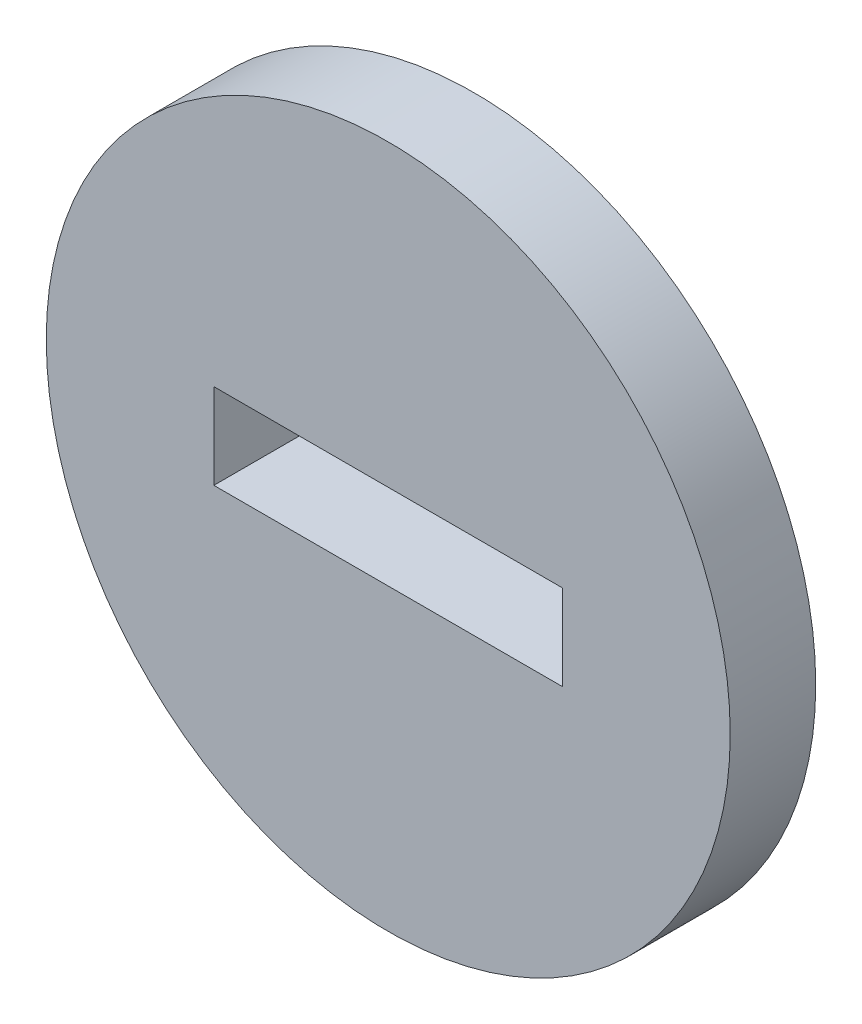
ISO-10303-21;
HEADER;
FILE_DESCRIPTION(('STEP AP214'),'2;1');
FILE_NAME('part.step','',(''),(''),'','','');
FILE_SCHEMA(('AUTOMOTIVE_DESIGN { 1 0 10303 214 1 1 1 1 }'));
ENDSEC;
DATA;
#1=APPLICATION_CONTEXT('core data for automotive mechanical design processes');
#2=APPLICATION_PROTOCOL_DEFINITION('international standard','automotive_design',2000,#1);
#3=PRODUCT_CONTEXT('',#1,'mechanical');
#4=PRODUCT('Part','Part','',(#3));
#5=PRODUCT_RELATED_PRODUCT_CATEGORY('part','',(#4));
#6=PRODUCT_DEFINITION_FORMATION('','',#4);
#7=PRODUCT_DEFINITION_CONTEXT('part definition',#1,'design');
#8=PRODUCT_DEFINITION('design','',#6,#7);
#9=PRODUCT_DEFINITION_SHAPE('','',#8);
#10=(LENGTH_UNIT() NAMED_UNIT(*) SI_UNIT(.MILLI.,.METRE.));
#11=(NAMED_UNIT(*) PLANE_ANGLE_UNIT() SI_UNIT($,.RADIAN.));
#12=(NAMED_UNIT(*) SI_UNIT($,.STERADIAN.) SOLID_ANGLE_UNIT());
#13=UNCERTAINTY_MEASURE_WITH_UNIT(LENGTH_MEASURE(1.E-05),#10,'distance_accuracy_value','');
#14=(GEOMETRIC_REPRESENTATION_CONTEXT(3) GLOBAL_UNCERTAINTY_ASSIGNED_CONTEXT((#13)) GLOBAL_UNIT_ASSIGNED_CONTEXT((#10,
#11,#12)) REPRESENTATION_CONTEXT('',''));
#15=CARTESIAN_POINT('',(0.,0.,0.));
#16=DIRECTION('',(0.,0.,1.));
#17=DIRECTION('',(1.,0.,0.));
#18=AXIS2_PLACEMENT_3D('',#15,#16,#17);
#19=CARTESIAN_POINT('',(0.,0.,2.5));
#20=DIRECTION('',(0.,0.,1.));
#21=DIRECTION('',(1.,0.,0.));
#22=AXIS2_PLACEMENT_3D('',#19,#20,#21);
#23=PLANE('',#22);
#24=CARTESIAN_POINT('',(0.,0.,2.5));
#25=DIRECTION('',(0.,0.,1.));
#26=DIRECTION('',(1.,0.,0.));
#27=AXIS2_PLACEMENT_3D('',#24,#25,#26);
#28=CIRCLE('',#27,10.);
#29=CARTESIAN_POINT('',(10.,0.,2.5));
#30=VERTEX_POINT('',#29);
#31=EDGE_CURVE('E11',#30,#30,#28,.T.);
#32=ORIENTED_EDGE('',*,*,#31,.T.);
#33=EDGE_LOOP('',(#32));
#34=FACE_BOUND('',#33,.T.);
#35=DIRECTION('',(-1.,0.,0.));
#36=VECTOR('',#35,1.);
#37=CARTESIAN_POINT('',(-5.1,1.25,2.5));
#38=LINE('',#37,#36);
#39=CARTESIAN_POINT('',(5.1,1.25,2.5));
#40=VERTEX_POINT('',#39);
#41=CARTESIAN_POINT('',(-5.1,1.25,2.5));
#42=VERTEX_POINT('',#41);
#43=EDGE_CURVE('E86',#40,#42,#38,.T.);
#44=ORIENTED_EDGE('',*,*,#43,.F.);
#45=DIRECTION('',(0.,1.,0.));
#46=VECTOR('',#45,1.);
#47=CARTESIAN_POINT('',(5.1,-1.25,2.5));
#48=LINE('',#47,#46);
#49=CARTESIAN_POINT('',(5.1,-1.25,2.5));
#50=VERTEX_POINT('',#49);
#51=EDGE_CURVE('E78',#50,#40,#48,.T.);
#52=ORIENTED_EDGE('',*,*,#51,.F.);
#53=DIRECTION('',(1.,0.,0.));
#54=VECTOR('',#53,1.);
#55=CARTESIAN_POINT('',(-5.1,-1.25,2.5));
#56=LINE('',#55,#54);
#57=CARTESIAN_POINT('',(-5.1,-1.25,2.5));
#58=VERTEX_POINT('',#57);
#59=EDGE_CURVE('E99',#58,#50,#56,.T.);
#60=ORIENTED_EDGE('',*,*,#59,.F.);
#61=DIRECTION('',(0.,-1.,0.));
#62=VECTOR('',#61,1.);
#63=CARTESIAN_POINT('',(-5.1,-1.25,2.5));
#64=LINE('',#63,#62);
#65=EDGE_CURVE('E97',#42,#58,#64,.T.);
#66=ORIENTED_EDGE('',*,*,#65,.F.);
#67=EDGE_LOOP('',(#44,#52,#60,#66));
#68=FACE_BOUND('',#67,.T.);
#69=ADVANCED_FACE('F37',(#34,#68),#23,.T.);
#70=CARTESIAN_POINT('',(0.,0.,0.));
#71=DIRECTION('',(0.,0.,1.));
#72=DIRECTION('',(1.,0.,0.));
#73=AXIS2_PLACEMENT_3D('',#70,#71,#72);
#74=PLANE('',#73);
#75=CARTESIAN_POINT('',(0.,0.,0.));
#76=DIRECTION('',(0.,0.,1.));
#77=DIRECTION('',(1.,0.,0.));
#78=AXIS2_PLACEMENT_3D('',#75,#76,#77);
#79=CIRCLE('',#78,10.);
#80=CARTESIAN_POINT('',(10.,0.,0.));
#81=VERTEX_POINT('',#80);
#82=EDGE_CURVE('E41',#81,#81,#79,.T.);
#83=ORIENTED_EDGE('',*,*,#82,.F.);
#84=EDGE_LOOP('',(#83));
#85=FACE_BOUND('',#84,.T.);
#86=DIRECTION('',(0.,1.,0.));
#87=VECTOR('',#86,1.);
#88=CARTESIAN_POINT('',(5.1,-1.25,0.));
#89=LINE('',#88,#87);
#90=CARTESIAN_POINT('',(5.1,-1.25,0.));
#91=VERTEX_POINT('',#90);
#92=CARTESIAN_POINT('',(5.1,1.25,0.));
#93=VERTEX_POINT('',#92);
#94=EDGE_CURVE('E60',#91,#93,#89,.T.);
#95=ORIENTED_EDGE('',*,*,#94,.T.);
#96=DIRECTION('',(-1.,0.,0.));
#97=VECTOR('',#96,1.);
#98=CARTESIAN_POINT('',(-5.1,1.25,0.));
#99=LINE('',#98,#97);
#100=CARTESIAN_POINT('',(-5.1,1.25,0.));
#101=VERTEX_POINT('',#100);
#102=EDGE_CURVE('E93',#93,#101,#99,.T.);
#103=ORIENTED_EDGE('',*,*,#102,.T.);
#104=DIRECTION('',(0.,-1.,0.));
#105=VECTOR('',#104,1.);
#106=CARTESIAN_POINT('',(-5.1,-1.25,0.));
#107=LINE('',#106,#105);
#108=CARTESIAN_POINT('',(-5.1,-1.25,0.));
#109=VERTEX_POINT('',#108);
#110=EDGE_CURVE('E105',#101,#109,#107,.T.);
#111=ORIENTED_EDGE('',*,*,#110,.T.);
#112=DIRECTION('',(1.,0.,0.));
#113=VECTOR('',#112,1.);
#114=CARTESIAN_POINT('',(-5.1,-1.25,0.));
#115=LINE('',#114,#113);
#116=EDGE_CURVE('E87',#109,#91,#115,.T.);
#117=ORIENTED_EDGE('',*,*,#116,.T.);
#118=EDGE_LOOP('',(#95,#103,#111,#117));
#119=FACE_BOUND('',#118,.T.);
#120=ADVANCED_FACE('F116',(#85,#119),#74,.F.);
#121=CARTESIAN_POINT('',(0.,0.,2.5));
#122=DIRECTION('',(0.,0.,-1.));
#123=DIRECTION('',(-1.,0.,0.));
#124=AXIS2_PLACEMENT_3D('',#121,#122,#123);
#125=CYLINDRICAL_SURFACE('',#124,10.);
#126=ORIENTED_EDGE('',*,*,#31,.F.);
#127=EDGE_LOOP('',(#126));
#128=FACE_BOUND('',#127,.T.);
#129=ORIENTED_EDGE('',*,*,#82,.T.);
#130=EDGE_LOOP('',(#129));
#131=FACE_BOUND('',#130,.T.);
#132=ADVANCED_FACE('F39',(#128,#131),#125,.T.);
#133=CARTESIAN_POINT('',(5.1,-1.25,2.5));
#134=DIRECTION('',(-1.,0.,0.));
#135=DIRECTION('',(0.,0.,1.));
#136=AXIS2_PLACEMENT_3D('',#133,#134,#135);
#137=PLANE('',#136);
#138=ORIENTED_EDGE('',*,*,#94,.F.);
#139=DIRECTION('',(0.,0.,-1.));
#140=VECTOR('',#139,1.);
#141=CARTESIAN_POINT('',(5.1,-1.25,2.5));
#142=LINE('',#141,#140);
#143=EDGE_CURVE('E82',#50,#91,#142,.T.);
#144=ORIENTED_EDGE('',*,*,#143,.F.);
#145=ORIENTED_EDGE('',*,*,#51,.T.);
#146=DIRECTION('',(0.,0.,-1.));
#147=VECTOR('',#146,1.);
#148=CARTESIAN_POINT('',(5.1,1.25,2.5));
#149=LINE('',#148,#147);
#150=EDGE_CURVE('E81',#40,#93,#149,.T.);
#151=ORIENTED_EDGE('',*,*,#150,.T.);
#152=EDGE_LOOP('',(#138,#144,#145,#151));
#153=FACE_BOUND('',#152,.T.);
#154=ADVANCED_FACE('F80',(#153),#137,.T.);
#155=CARTESIAN_POINT('',(-5.1,1.25,2.5));
#156=DIRECTION('',(0.,-1.,0.));
#157=DIRECTION('',(0.,0.,-1.));
#158=AXIS2_PLACEMENT_3D('',#155,#156,#157);
#159=PLANE('',#158);
#160=ORIENTED_EDGE('',*,*,#102,.F.);
#161=ORIENTED_EDGE('',*,*,#150,.F.);
#162=ORIENTED_EDGE('',*,*,#43,.T.);
#163=DIRECTION('',(0.,0.,-1.));
#164=VECTOR('',#163,1.);
#165=CARTESIAN_POINT('',(-5.1,1.25,2.5));
#166=LINE('',#165,#164);
#167=EDGE_CURVE('E94',#42,#101,#166,.T.);
#168=ORIENTED_EDGE('',*,*,#167,.T.);
#169=EDGE_LOOP('',(#160,#161,#162,#168));
#170=FACE_BOUND('',#169,.T.);
#171=ADVANCED_FACE('F90',(#170),#159,.T.);
#172=CARTESIAN_POINT('',(-5.1,-1.25,2.5));
#173=DIRECTION('',(1.,0.,0.));
#174=DIRECTION('',(0.,0.,-1.));
#175=AXIS2_PLACEMENT_3D('',#172,#173,#174);
#176=PLANE('',#175);
#177=ORIENTED_EDGE('',*,*,#110,.F.);
#178=ORIENTED_EDGE('',*,*,#167,.F.);
#179=ORIENTED_EDGE('',*,*,#65,.T.);
#180=DIRECTION('',(0.,0.,-1.));
#181=VECTOR('',#180,1.);
#182=CARTESIAN_POINT('',(-5.1,-1.25,2.5));
#183=LINE('',#182,#181);
#184=EDGE_CURVE('E52',#58,#109,#183,.T.);
#185=ORIENTED_EDGE('',*,*,#184,.T.);
#186=EDGE_LOOP('',(#177,#178,#179,#185));
#187=FACE_BOUND('',#186,.T.);
#188=ADVANCED_FACE('F114',(#187),#176,.T.);
#189=CARTESIAN_POINT('',(-5.1,-1.25,2.5));
#190=DIRECTION('',(0.,1.,0.));
#191=DIRECTION('',(0.,0.,1.));
#192=AXIS2_PLACEMENT_3D('',#189,#190,#191);
#193=PLANE('',#192);
#194=ORIENTED_EDGE('',*,*,#116,.F.);
#195=ORIENTED_EDGE('',*,*,#184,.F.);
#196=ORIENTED_EDGE('',*,*,#59,.T.);
#197=ORIENTED_EDGE('',*,*,#143,.T.);
#198=EDGE_LOOP('',(#194,#195,#196,#197));
#199=FACE_BOUND('',#198,.T.);
#200=ADVANCED_FACE('F117',(#199),#193,.T.);
#201=CLOSED_SHELL('',(#69,#120,#132,#154,#171,#188,#200));
#202=MANIFOLD_SOLID_BREP('B2',#201);
#203=ADVANCED_BREP_SHAPE_REPRESENTATION('',(#18,#202),#14);
#204=SHAPE_DEFINITION_REPRESENTATION(#9,#203);
ENDSEC;
END-ISO-10303-21;
